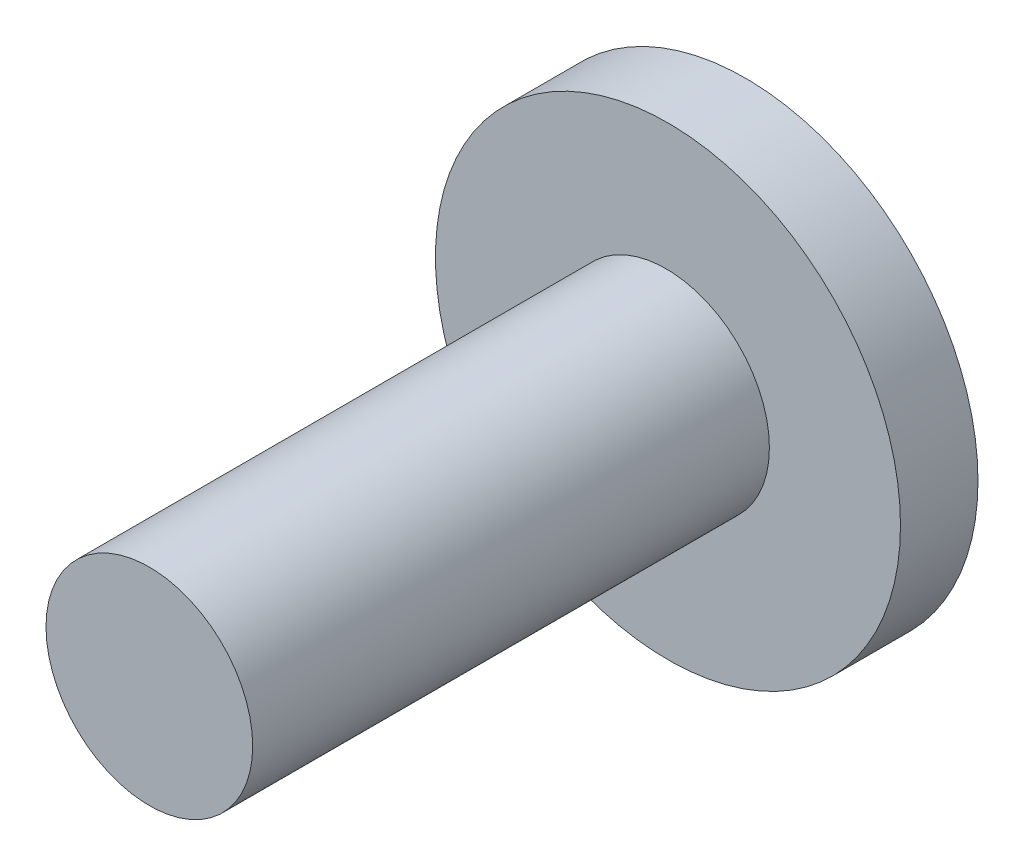
ISO-10303-21;
HEADER;
FILE_DESCRIPTION(('STEP AP214'),'2;1');
FILE_NAME('part.step','',(''),(''),'','','');
FILE_SCHEMA(('AUTOMOTIVE_DESIGN { 1 0 10303 214 1 1 1 1 }'));
ENDSEC;
DATA;
#1=APPLICATION_CONTEXT('core data for automotive mechanical design processes');
#2=APPLICATION_PROTOCOL_DEFINITION('international standard','automotive_design',2000,#1);
#3=PRODUCT_CONTEXT('',#1,'mechanical');
#4=PRODUCT('Part','Part','',(#3));
#5=PRODUCT_RELATED_PRODUCT_CATEGORY('part','',(#4));
#6=PRODUCT_DEFINITION_FORMATION('','',#4);
#7=PRODUCT_DEFINITION_CONTEXT('part definition',#1,'design');
#8=PRODUCT_DEFINITION('design','',#6,#7);
#9=PRODUCT_DEFINITION_SHAPE('','',#8);
#10=(LENGTH_UNIT() NAMED_UNIT(*) SI_UNIT(.MILLI.,.METRE.));
#11=(NAMED_UNIT(*) PLANE_ANGLE_UNIT() SI_UNIT($,.RADIAN.));
#12=(NAMED_UNIT(*) SI_UNIT($,.STERADIAN.) SOLID_ANGLE_UNIT());
#13=UNCERTAINTY_MEASURE_WITH_UNIT(LENGTH_MEASURE(1.E-05),#10,'distance_accuracy_value','');
#14=(GEOMETRIC_REPRESENTATION_CONTEXT(3) GLOBAL_UNCERTAINTY_ASSIGNED_CONTEXT((#13)) GLOBAL_UNIT_ASSIGNED_CONTEXT((#10,
#11,#12)) REPRESENTATION_CONTEXT('',''));
#15=CARTESIAN_POINT('',(0.,0.,0.));
#16=DIRECTION('',(0.,0.,1.));
#17=DIRECTION('',(1.,0.,0.));
#18=AXIS2_PLACEMENT_3D('',#15,#16,#17);
#19=CARTESIAN_POINT('',(0.00365437001625469,0.,10.0001));
#20=DIRECTION('',(0.,0.,-1.));
#21=DIRECTION('',(-1.,0.,0.));
#22=AXIS2_PLACEMENT_3D('',#19,#20,#21);
#23=CYLINDRICAL_SURFACE('',#22,2.73684937714953);
#24=CARTESIAN_POINT('',(0.00365437001625469,0.,-9.99999999994061E-05));
#25=DIRECTION('',(0.,0.,1.));
#26=DIRECTION('',(1.,0.,0.));
#27=AXIS2_PLACEMENT_3D('',#24,#25,#26);
#28=CIRCLE('',#27,2.73684937714953);
#29=CARTESIAN_POINT('',(-2.10059003432555,-1.75,-9.99999999994061E-05));
#30=VERTEX_POINT('',#29);
#31=CARTESIAN_POINT('',(-2.10059003432555,1.75,-9.99999999994061E-05));
#32=VERTEX_POINT('',#31);
#33=EDGE_CURVE('E52',#30,#32,#28,.F.);
#34=ORIENTED_EDGE('',*,*,#33,.F.);
#35=DIRECTION('',(0.,0.,-1.));
#36=VECTOR('',#35,1.);
#37=CARTESIAN_POINT('',(-2.10059003432555,-1.75,10.0001));
#38=LINE('',#37,#36);
#39=CARTESIAN_POINT('',(-2.10059003432555,-1.75,-0.999999999999999));
#40=VERTEX_POINT('',#39);
#41=EDGE_CURVE('E114',#30,#40,#38,.T.);
#42=ORIENTED_EDGE('',*,*,#41,.T.);
#43=CARTESIAN_POINT('',(0.00365437001625469,0.,-0.999999999999999));
#44=DIRECTION('',(0.,0.,1.));
#45=DIRECTION('',(1.,0.,0.));
#46=AXIS2_PLACEMENT_3D('',#43,#44,#45);
#47=CIRCLE('',#46,2.73684937714953);
#48=CARTESIAN_POINT('',(-2.10059003432555,1.75,-1.));
#49=VERTEX_POINT('',#48);
#50=EDGE_CURVE('E104',#49,#40,#47,.T.);
#51=ORIENTED_EDGE('',*,*,#50,.F.);
#52=DIRECTION('',(0.,0.,-1.));
#53=VECTOR('',#52,1.);
#54=CARTESIAN_POINT('',(-2.10059003432555,1.75,10.0001));
#55=LINE('',#54,#53);
#56=EDGE_CURVE('E88',#32,#49,#55,.T.);
#57=ORIENTED_EDGE('',*,*,#56,.F.);
#58=EDGE_LOOP('',(#34,#42,#51,#57));
#59=FACE_BOUND('',#58,.T.);
#60=ADVANCED_FACE('F36',(#59),#23,.F.);
#61=CARTESIAN_POINT('',(0.,-1.75,10.0001));
#62=DIRECTION('',(0.,1.,0.));
#63=DIRECTION('',(0.,0.,1.));
#64=AXIS2_PLACEMENT_3D('',#61,#62,#63);
#65=PLANE('',#64);
#66=ORIENTED_EDGE('',*,*,#41,.F.);
#67=DIRECTION('',(1.,0.,0.));
#68=VECTOR('',#67,1.);
#69=CARTESIAN_POINT('',(0.,-1.75,-9.99999999994061E-05));
#70=LINE('',#69,#68);
#71=CARTESIAN_POINT('',(2.14205065279373,-1.75,-9.99999999994061E-05));
#72=VERTEX_POINT('',#71);
#73=EDGE_CURVE('E59',#30,#72,#70,.T.);
#74=ORIENTED_EDGE('',*,*,#73,.T.);
#75=DIRECTION('',(0.,0.,-1.));
#76=VECTOR('',#75,1.);
#77=CARTESIAN_POINT('',(2.14205065279373,-1.75,10.0001));
#78=LINE('',#77,#76);
#79=CARTESIAN_POINT('',(2.14205065279373,-1.75,-0.999999999999999));
#80=VERTEX_POINT('',#79);
#81=EDGE_CURVE('E87',#72,#80,#78,.T.);
#82=ORIENTED_EDGE('',*,*,#81,.T.);
#83=DIRECTION('',(-1.,0.,0.));
#84=VECTOR('',#83,1.);
#85=CARTESIAN_POINT('',(0.,-1.75,-1.));
#86=LINE('',#85,#84);
#87=EDGE_CURVE('E108',#80,#40,#86,.T.);
#88=ORIENTED_EDGE('',*,*,#87,.T.);
#89=EDGE_LOOP('',(#66,#74,#82,#88));
#90=FACE_BOUND('',#89,.T.);
#91=ADVANCED_FACE('F146',(#90),#65,.T.);
#92=CARTESIAN_POINT('',(0.,0.,10.0001));
#93=DIRECTION('',(0.,0.,-1.));
#94=DIRECTION('',(-1.,0.,0.));
#95=AXIS2_PLACEMENT_3D('',#92,#93,#94);
#96=CYLINDRICAL_SURFACE('',#95,2.76602259555739);
#97=CARTESIAN_POINT('',(0.,0.,-9.99999999994061E-05));
#98=DIRECTION('',(0.,0.,1.));
#99=DIRECTION('',(1.,0.,0.));
#100=AXIS2_PLACEMENT_3D('',#97,#98,#99);
#101=CIRCLE('',#100,2.76602259555739);
#102=CARTESIAN_POINT('',(2.14205065279373,1.75,-9.99999999994061E-05));
#103=VERTEX_POINT('',#102);
#104=EDGE_CURVE('E91',#103,#72,#101,.F.);
#105=ORIENTED_EDGE('',*,*,#104,.F.);
#106=DIRECTION('',(0.,0.,-1.));
#107=VECTOR('',#106,1.);
#108=CARTESIAN_POINT('',(2.14205065279373,1.75,10.0001));
#109=LINE('',#108,#107);
#110=CARTESIAN_POINT('',(2.14205065279373,1.75,-0.999999999999999));
#111=VERTEX_POINT('',#110);
#112=EDGE_CURVE('E78',#103,#111,#109,.T.);
#113=ORIENTED_EDGE('',*,*,#112,.T.);
#114=CARTESIAN_POINT('',(0.,0.,-0.999999999999999));
#115=DIRECTION('',(0.,0.,1.));
#116=DIRECTION('',(1.,0.,0.));
#117=AXIS2_PLACEMENT_3D('',#114,#115,#116);
#118=CIRCLE('',#117,2.76602259555739);
#119=EDGE_CURVE('E111',#80,#111,#118,.T.);
#120=ORIENTED_EDGE('',*,*,#119,.F.);
#121=ORIENTED_EDGE('',*,*,#81,.F.);
#122=EDGE_LOOP('',(#105,#113,#120,#121));
#123=FACE_BOUND('',#122,.T.);
#124=ADVANCED_FACE('F92',(#123),#96,.F.);
#125=CARTESIAN_POINT('',(0.,1.75,10.0001));
#126=DIRECTION('',(0.,1.,0.));
#127=DIRECTION('',(0.,0.,1.));
#128=AXIS2_PLACEMENT_3D('',#125,#126,#127);
#129=PLANE('',#128);
#130=DIRECTION('',(1.,0.,0.));
#131=VECTOR('',#130,1.);
#132=CARTESIAN_POINT('',(0.,1.75,-9.99999999994061E-05));
#133=LINE('',#132,#131);
#134=EDGE_CURVE('E40',#32,#103,#133,.T.);
#135=ORIENTED_EDGE('',*,*,#134,.F.);
#136=ORIENTED_EDGE('',*,*,#56,.T.);
#137=DIRECTION('',(-1.,0.,0.));
#138=VECTOR('',#137,1.);
#139=CARTESIAN_POINT('',(0.,1.75,-1.));
#140=LINE('',#139,#138);
#141=EDGE_CURVE('E83',#111,#49,#140,.T.);
#142=ORIENTED_EDGE('',*,*,#141,.F.);
#143=ORIENTED_EDGE('',*,*,#112,.F.);
#144=EDGE_LOOP('',(#135,#136,#142,#143));
#145=FACE_BOUND('',#144,.T.);
#146=ADVANCED_FACE('F80',(#145),#129,.F.);
#147=CARTESIAN_POINT('',(0.,0.,-1.));
#148=DIRECTION('',(0.,0.,1.));
#149=DIRECTION('',(1.,0.,0.));
#150=AXIS2_PLACEMENT_3D('',#147,#148,#149);
#151=CYLINDRICAL_SURFACE('',#150,9.);
#152=CARTESIAN_POINT('',(0.,0.,-1.));
#153=DIRECTION('',(0.,0.,1.));
#154=DIRECTION('',(1.,0.,0.));
#155=AXIS2_PLACEMENT_3D('',#152,#153,#154);
#156=CIRCLE('',#155,9.);
#157=CARTESIAN_POINT('',(9.,0.,-1.));
#158=VERTEX_POINT('',#157);
#159=EDGE_CURVE('E97',#158,#158,#156,.T.);
#160=ORIENTED_EDGE('',*,*,#159,.T.);
#161=EDGE_LOOP('',(#160));
#162=FACE_BOUND('',#161,.T.);
#163=CARTESIAN_POINT('',(0.,0.,2.));
#164=DIRECTION('',(0.,0.,1.));
#165=DIRECTION('',(1.,0.,0.));
#166=AXIS2_PLACEMENT_3D('',#163,#164,#165);
#167=CIRCLE('',#166,9.);
#168=CARTESIAN_POINT('',(9.,0.,2.));
#169=VERTEX_POINT('',#168);
#170=EDGE_CURVE('E99',#169,#169,#167,.T.);
#171=ORIENTED_EDGE('',*,*,#170,.F.);
#172=EDGE_LOOP('',(#171));
#173=FACE_BOUND('',#172,.T.);
#174=ADVANCED_FACE('F136',(#162,#173),#151,.T.);
#175=CARTESIAN_POINT('',(0.,0.,-1.));
#176=DIRECTION('',(0.,0.,1.));
#177=DIRECTION('',(1.,0.,0.));
#178=AXIS2_PLACEMENT_3D('',#175,#176,#177);
#179=PLANE('',#178);
#180=ORIENTED_EDGE('',*,*,#141,.T.);
#181=ORIENTED_EDGE('',*,*,#50,.T.);
#182=ORIENTED_EDGE('',*,*,#87,.F.);
#183=ORIENTED_EDGE('',*,*,#119,.T.);
#184=EDGE_LOOP('',(#180,#181,#182,#183));
#185=FACE_BOUND('',#184,.T.);
#186=ORIENTED_EDGE('',*,*,#159,.F.);
#187=EDGE_LOOP('',(#186));
#188=FACE_BOUND('',#187,.T.);
#189=ADVANCED_FACE('F133',(#185,#188),#179,.F.);
#190=CARTESIAN_POINT('',(0.,0.,2.));
#191=DIRECTION('',(0.,0.,1.));
#192=DIRECTION('',(1.,0.,0.));
#193=AXIS2_PLACEMENT_3D('',#190,#191,#192);
#194=PLANE('',#193);
#195=CARTESIAN_POINT('',(-0.0740586033856992,0.0740586033857044,2.));
#196=DIRECTION('',(0.,0.,1.));
#197=DIRECTION('',(1.,0.,0.));
#198=AXIS2_PLACEMENT_3D('',#195,#196,#197);
#199=CIRCLE('',#198,4.);
#200=CARTESIAN_POINT('',(3.9259413966143,0.0740586033857044,2.));
#201=VERTEX_POINT('',#200);
#202=EDGE_CURVE('E11',#201,#201,#199,.T.);
#203=ORIENTED_EDGE('',*,*,#202,.F.);
#204=EDGE_LOOP('',(#203));
#205=FACE_BOUND('',#204,.T.);
#206=ORIENTED_EDGE('',*,*,#170,.T.);
#207=EDGE_LOOP('',(#206));
#208=FACE_BOUND('',#207,.T.);
#209=ADVANCED_FACE('F38',(#205,#208),#194,.T.);
#210=CARTESIAN_POINT('',(0.,0.,-0.0001));
#211=DIRECTION('',(0.,0.,1.));
#212=DIRECTION('',(1.,0.,0.));
#213=AXIS2_PLACEMENT_3D('',#210,#211,#212);
#214=PLANE('',#213);
#215=ORIENTED_EDGE('',*,*,#73,.F.);
#216=ORIENTED_EDGE('',*,*,#33,.T.);
#217=ORIENTED_EDGE('',*,*,#134,.T.);
#218=ORIENTED_EDGE('',*,*,#104,.T.);
#219=EDGE_LOOP('',(#215,#216,#217,#218));
#220=FACE_BOUND('',#219,.T.);
#221=ADVANCED_FACE('F96',(#220),#214,.F.);
#222=CARTESIAN_POINT('',(-0.0740586033856992,0.0740586033857044,22.));
#223=DIRECTION('',(0.,0.,-1.));
#224=DIRECTION('',(-1.,0.,0.));
#225=AXIS2_PLACEMENT_3D('',#222,#223,#224);
#226=CYLINDRICAL_SURFACE('',#225,4.);
#227=CARTESIAN_POINT('',(-0.0740586033856992,0.0740586033857044,22.));
#228=DIRECTION('',(0.,0.,1.));
#229=DIRECTION('',(1.,0.,0.));
#230=AXIS2_PLACEMENT_3D('',#227,#228,#229);
#231=CIRCLE('',#230,4.);
#232=CARTESIAN_POINT('',(3.9259413966143,0.0740586033857044,22.));
#233=VERTEX_POINT('',#232);
#234=EDGE_CURVE('E94',#233,#233,#231,.T.);
#235=ORIENTED_EDGE('',*,*,#234,.F.);
#236=EDGE_LOOP('',(#235));
#237=FACE_BOUND('',#236,.T.);
#238=ORIENTED_EDGE('',*,*,#202,.T.);
#239=EDGE_LOOP('',(#238));
#240=FACE_BOUND('',#239,.T.);
#241=ADVANCED_FACE('F125',(#237,#240),#226,.T.);
#242=CARTESIAN_POINT('',(-0.0740586033856992,0.0740586033857044,22.));
#243=DIRECTION('',(0.,0.,1.));
#244=DIRECTION('',(1.,0.,0.));
#245=AXIS2_PLACEMENT_3D('',#242,#243,#244);
#246=PLANE('',#245);
#247=ORIENTED_EDGE('',*,*,#234,.T.);
#248=EDGE_LOOP('',(#247));
#249=FACE_BOUND('',#248,.T.);
#250=ADVANCED_FACE('F123',(#249),#246,.T.);
#251=CLOSED_SHELL('',(#60,#91,#124,#146,#174,#189,#209,#221,#241,#250));
#252=MANIFOLD_SOLID_BREP('B2',#251);
#253=ADVANCED_BREP_SHAPE_REPRESENTATION('',(#18,#252),#14);
#254=SHAPE_DEFINITION_REPRESENTATION(#9,#253);
ENDSEC;
END-ISO-10303-21;
